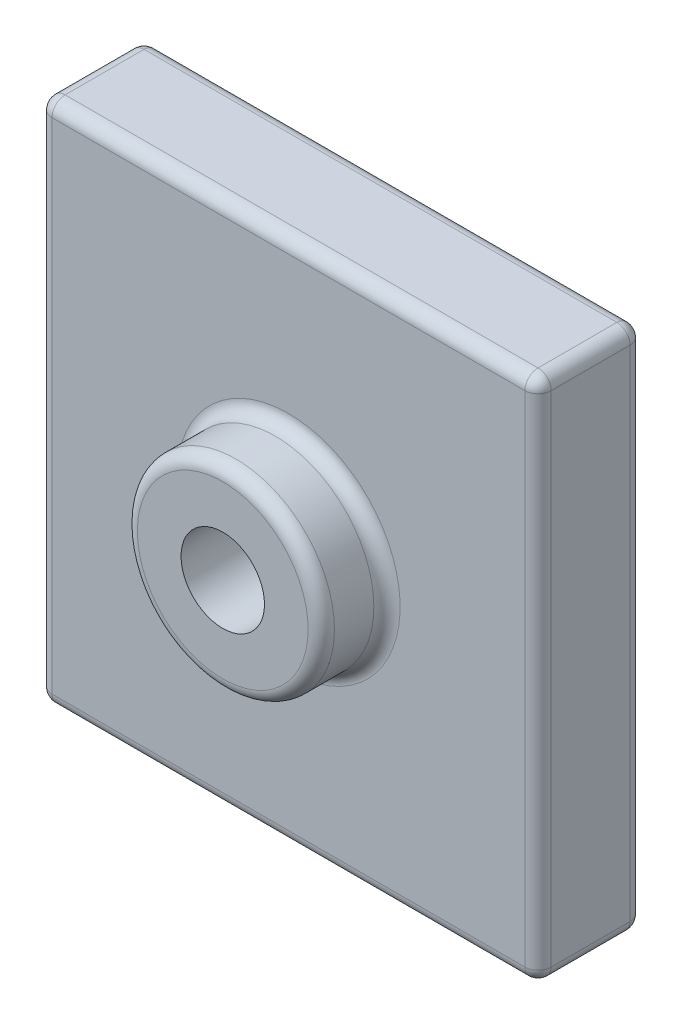
ISO-10303-21;
HEADER;
FILE_DESCRIPTION(('STEP AP214'),'2;1');
FILE_NAME('part.step','',(''),(''),'','','');
FILE_SCHEMA(('AUTOMOTIVE_DESIGN { 1 0 10303 214 1 1 1 1 }'));
ENDSEC;
DATA;
#1=APPLICATION_CONTEXT('core data for automotive mechanical design processes');
#2=APPLICATION_PROTOCOL_DEFINITION('international standard','automotive_design',2000,#1);
#3=PRODUCT_CONTEXT('',#1,'mechanical');
#4=PRODUCT('Part','Part','',(#3));
#5=PRODUCT_RELATED_PRODUCT_CATEGORY('part','',(#4));
#6=PRODUCT_DEFINITION_FORMATION('','',#4);
#7=PRODUCT_DEFINITION_CONTEXT('part definition',#1,'design');
#8=PRODUCT_DEFINITION('design','',#6,#7);
#9=PRODUCT_DEFINITION_SHAPE('','',#8);
#10=(LENGTH_UNIT() NAMED_UNIT(*) SI_UNIT(.MILLI.,.METRE.));
#11=(NAMED_UNIT(*) PLANE_ANGLE_UNIT() SI_UNIT($,.RADIAN.));
#12=(NAMED_UNIT(*) SI_UNIT($,.STERADIAN.) SOLID_ANGLE_UNIT());
#13=UNCERTAINTY_MEASURE_WITH_UNIT(LENGTH_MEASURE(1.E-05),#10,'distance_accuracy_value','');
#14=(GEOMETRIC_REPRESENTATION_CONTEXT(3) GLOBAL_UNCERTAINTY_ASSIGNED_CONTEXT((#13)) GLOBAL_UNIT_ASSIGNED_CONTEXT((#10,
#11,#12)) REPRESENTATION_CONTEXT('',''));
#15=CARTESIAN_POINT('',(0.,0.,0.));
#16=DIRECTION('',(0.,0.,1.));
#17=DIRECTION('',(1.,0.,0.));
#18=AXIS2_PLACEMENT_3D('',#15,#16,#17);
#19=CARTESIAN_POINT('',(0.,0.,8.));
#20=DIRECTION('',(1.,0.,0.));
#21=DIRECTION('',(0.,0.,-1.));
#22=AXIS2_PLACEMENT_3D('',#19,#20,#21);
#23=PLANE('',#22);
#24=DIRECTION('',(0.,0.,-1.));
#25=VECTOR('',#24,1.);
#26=CARTESIAN_POINT('',(0.,39.,8.));
#27=LINE('',#26,#25);
#28=CARTESIAN_POINT('',(0.,39.,7.));
#29=VERTEX_POINT('',#28);
#30=CARTESIAN_POINT('',(0.,39.,1.));
#31=VERTEX_POINT('',#30);
#32=EDGE_CURVE('E267',#29,#31,#27,.T.);
#33=ORIENTED_EDGE('',*,*,#32,.T.);
#34=DIRECTION('',(0.,-1.,0.));
#35=VECTOR('',#34,1.);
#36=CARTESIAN_POINT('',(0.,0.,1.));
#37=LINE('',#36,#35);
#38=CARTESIAN_POINT('',(0.,1.,1.));
#39=VERTEX_POINT('',#38);
#40=EDGE_CURVE('E270',#31,#39,#37,.T.);
#41=ORIENTED_EDGE('',*,*,#40,.T.);
#42=DIRECTION('',(0.,0.,-1.));
#43=VECTOR('',#42,1.);
#44=CARTESIAN_POINT('',(0.,1.,8.));
#45=LINE('',#44,#43);
#46=CARTESIAN_POINT('',(0.,1.,7.));
#47=VERTEX_POINT('',#46);
#48=EDGE_CURVE('E265',#39,#47,#45,.F.);
#49=ORIENTED_EDGE('',*,*,#48,.T.);
#50=DIRECTION('',(0.,-1.,0.));
#51=VECTOR('',#50,1.);
#52=CARTESIAN_POINT('',(0.,0.,7.));
#53=LINE('',#52,#51);
#54=EDGE_CURVE('E263',#47,#29,#53,.F.);
#55=ORIENTED_EDGE('',*,*,#54,.T.);
#56=EDGE_LOOP('',(#33,#41,#49,#55));
#57=FACE_BOUND('',#56,.T.);
#58=ADVANCED_FACE('F33',(#57),#23,.F.);
#59=CARTESIAN_POINT('',(0.,0.,8.));
#60=DIRECTION('',(0.,1.,0.));
#61=DIRECTION('',(0.,0.,1.));
#62=AXIS2_PLACEMENT_3D('',#59,#60,#61);
#63=PLANE('',#62);
#64=DIRECTION('',(0.,0.,-1.));
#65=VECTOR('',#64,1.);
#66=CARTESIAN_POINT('',(1.,0.,8.));
#67=LINE('',#66,#65);
#68=CARTESIAN_POINT('',(1.,0.,7.));
#69=VERTEX_POINT('',#68);
#70=CARTESIAN_POINT('',(1.,0.,1.));
#71=VERTEX_POINT('',#70);
#72=EDGE_CURVE('E229',#69,#71,#67,.T.);
#73=ORIENTED_EDGE('',*,*,#72,.T.);
#74=DIRECTION('',(1.,0.,0.));
#75=VECTOR('',#74,1.);
#76=CARTESIAN_POINT('',(38.,0.,1.));
#77=LINE('',#76,#75);
#78=CARTESIAN_POINT('',(37.,0.,1.));
#79=VERTEX_POINT('',#78);
#80=EDGE_CURVE('E233',#71,#79,#77,.T.);
#81=ORIENTED_EDGE('',*,*,#80,.T.);
#82=DIRECTION('',(0.,0.,-1.));
#83=VECTOR('',#82,1.);
#84=CARTESIAN_POINT('',(37.,0.,8.));
#85=LINE('',#84,#83);
#86=CARTESIAN_POINT('',(37.,0.,7.));
#87=VERTEX_POINT('',#86);
#88=EDGE_CURVE('E231',#79,#87,#85,.F.);
#89=ORIENTED_EDGE('',*,*,#88,.T.);
#90=DIRECTION('',(1.,0.,0.));
#91=VECTOR('',#90,1.);
#92=CARTESIAN_POINT('',(0.,0.,7.));
#93=LINE('',#92,#91);
#94=EDGE_CURVE('E227',#87,#69,#93,.F.);
#95=ORIENTED_EDGE('',*,*,#94,.T.);
#96=EDGE_LOOP('',(#73,#81,#89,#95));
#97=FACE_BOUND('',#96,.T.);
#98=ADVANCED_FACE('F435',(#97),#63,.F.);
#99=CARTESIAN_POINT('',(38.,0.,8.));
#100=DIRECTION('',(-1.,0.,0.));
#101=DIRECTION('',(0.,0.,1.));
#102=AXIS2_PLACEMENT_3D('',#99,#100,#101);
#103=PLANE('',#102);
#104=DIRECTION('',(0.,0.,-1.));
#105=VECTOR('',#104,1.);
#106=CARTESIAN_POINT('',(38.,1.,8.));
#107=LINE('',#106,#105);
#108=CARTESIAN_POINT('',(38.,1.,7.));
#109=VERTEX_POINT('',#108);
#110=CARTESIAN_POINT('',(38.,1.,1.));
#111=VERTEX_POINT('',#110);
#112=EDGE_CURVE('E258',#109,#111,#107,.T.);
#113=ORIENTED_EDGE('',*,*,#112,.T.);
#114=DIRECTION('',(0.,1.,0.));
#115=VECTOR('',#114,1.);
#116=CARTESIAN_POINT('',(38.,40.,1.));
#117=LINE('',#116,#115);
#118=CARTESIAN_POINT('',(38.,39.,1.));
#119=VERTEX_POINT('',#118);
#120=EDGE_CURVE('E261',#111,#119,#117,.T.);
#121=ORIENTED_EDGE('',*,*,#120,.T.);
#122=DIRECTION('',(0.,0.,-1.));
#123=VECTOR('',#122,1.);
#124=CARTESIAN_POINT('',(38.,39.,8.));
#125=LINE('',#124,#123);
#126=CARTESIAN_POINT('',(38.,39.,7.));
#127=VERTEX_POINT('',#126);
#128=EDGE_CURVE('E256',#119,#127,#125,.F.);
#129=ORIENTED_EDGE('',*,*,#128,.T.);
#130=DIRECTION('',(0.,1.,0.));
#131=VECTOR('',#130,1.);
#132=CARTESIAN_POINT('',(38.,0.,7.));
#133=LINE('',#132,#131);
#134=EDGE_CURVE('E254',#127,#109,#133,.F.);
#135=ORIENTED_EDGE('',*,*,#134,.T.);
#136=EDGE_LOOP('',(#113,#121,#129,#135));
#137=FACE_BOUND('',#136,.T.);
#138=ADVANCED_FACE('F440',(#137),#103,.F.);
#139=CARTESIAN_POINT('',(0.,40.,8.));
#140=DIRECTION('',(0.,-1.,0.));
#141=DIRECTION('',(0.,0.,-1.));
#142=AXIS2_PLACEMENT_3D('',#139,#140,#141);
#143=PLANE('',#142);
#144=DIRECTION('',(0.,0.,-1.));
#145=VECTOR('',#144,1.);
#146=CARTESIAN_POINT('',(37.,40.,8.));
#147=LINE('',#146,#145);
#148=CARTESIAN_POINT('',(37.,40.,7.));
#149=VERTEX_POINT('',#148);
#150=CARTESIAN_POINT('',(37.,40.,1.));
#151=VERTEX_POINT('',#150);
#152=EDGE_CURVE('E249',#149,#151,#147,.T.);
#153=ORIENTED_EDGE('',*,*,#152,.T.);
#154=DIRECTION('',(-1.,0.,0.));
#155=VECTOR('',#154,1.);
#156=CARTESIAN_POINT('',(0.,40.,1.));
#157=LINE('',#156,#155);
#158=CARTESIAN_POINT('',(1.,40.,1.));
#159=VERTEX_POINT('',#158);
#160=EDGE_CURVE('E251',#151,#159,#157,.T.);
#161=ORIENTED_EDGE('',*,*,#160,.T.);
#162=DIRECTION('',(0.,0.,-1.));
#163=VECTOR('',#162,1.);
#164=CARTESIAN_POINT('',(1.,40.,8.));
#165=LINE('',#164,#163);
#166=CARTESIAN_POINT('',(1.,40.,7.));
#167=VERTEX_POINT('',#166);
#168=EDGE_CURVE('E247',#159,#167,#165,.F.);
#169=ORIENTED_EDGE('',*,*,#168,.T.);
#170=DIRECTION('',(-1.,0.,0.));
#171=VECTOR('',#170,1.);
#172=CARTESIAN_POINT('',(0.,40.,7.));
#173=LINE('',#172,#171);
#174=EDGE_CURVE('E245',#167,#149,#173,.F.);
#175=ORIENTED_EDGE('',*,*,#174,.T.);
#176=EDGE_LOOP('',(#153,#161,#169,#175));
#177=FACE_BOUND('',#176,.T.);
#178=ADVANCED_FACE('F387',(#177),#143,.F.);
#179=CARTESIAN_POINT('',(0.,0.,8.));
#180=DIRECTION('',(0.,0.,-1.));
#181=DIRECTION('',(-1.,0.,0.));
#182=AXIS2_PLACEMENT_3D('',#179,#180,#181);
#183=PLANE('',#182);
#184=DIRECTION('',(0.,1.,0.));
#185=VECTOR('',#184,1.);
#186=CARTESIAN_POINT('',(37.,0.,8.));
#187=LINE('',#186,#185);
#188=CARTESIAN_POINT('',(37.,1.,8.));
#189=VERTEX_POINT('',#188);
#190=CARTESIAN_POINT('',(37.,39.,8.));
#191=VERTEX_POINT('',#190);
#192=EDGE_CURVE('E42',#189,#191,#187,.T.);
#193=ORIENTED_EDGE('',*,*,#192,.T.);
#194=DIRECTION('',(-1.,0.,0.));
#195=VECTOR('',#194,1.);
#196=CARTESIAN_POINT('',(0.,39.,8.));
#197=LINE('',#196,#195);
#198=CARTESIAN_POINT('',(1.,39.,8.));
#199=VERTEX_POINT('',#198);
#200=EDGE_CURVE('E11',#191,#199,#197,.T.);
#201=ORIENTED_EDGE('',*,*,#200,.T.);
#202=DIRECTION('',(0.,-1.,0.));
#203=VECTOR('',#202,1.);
#204=CARTESIAN_POINT('',(1.,0.,8.));
#205=LINE('',#204,#203);
#206=CARTESIAN_POINT('',(1.,1.,8.));
#207=VERTEX_POINT('',#206);
#208=EDGE_CURVE('E275',#199,#207,#205,.T.);
#209=ORIENTED_EDGE('',*,*,#208,.T.);
#210=DIRECTION('',(1.,0.,0.));
#211=VECTOR('',#210,1.);
#212=CARTESIAN_POINT('',(0.,1.,8.));
#213=LINE('',#212,#211);
#214=EDGE_CURVE('E277',#207,#189,#213,.T.);
#215=ORIENTED_EDGE('',*,*,#214,.T.);
#216=EDGE_LOOP('',(#193,#201,#209,#215));
#217=FACE_BOUND('',#216,.T.);
#218=CARTESIAN_POINT('',(19.,20.,8.));
#219=DIRECTION('',(0.,0.,-1.));
#220=DIRECTION('',(-1.,0.,0.));
#221=AXIS2_PLACEMENT_3D('',#218,#219,#220);
#222=CIRCLE('',#221,8.5);
#223=CARTESIAN_POINT('',(10.5,20.,8.));
#224=VERTEX_POINT('',#223);
#225=EDGE_CURVE('E272',#224,#224,#222,.T.);
#226=ORIENTED_EDGE('',*,*,#225,.T.);
#227=EDGE_LOOP('',(#226));
#228=FACE_BOUND('',#227,.T.);
#229=ADVANCED_FACE('F363',(#217,#228),#183,.F.);
#230=CARTESIAN_POINT('',(0.,0.,0.));
#231=DIRECTION('',(0.,0.,-1.));
#232=DIRECTION('',(-1.,0.,0.));
#233=AXIS2_PLACEMENT_3D('',#230,#231,#232);
#234=PLANE('',#233);
#235=DIRECTION('',(0.500000000000001,0.866025403784438,0.));
#236=VECTOR('',#235,1.);
#237=CARTESIAN_POINT('',(12.5839064584957,20.,0.));
#238=LINE('',#237,#236);
#239=CARTESIAN_POINT('',(12.5839064584957,20.,0.));
#240=VERTEX_POINT('',#239);
#241=CARTESIAN_POINT('',(15.7919532292478,25.5565,0.));
#242=VERTEX_POINT('',#241);
#243=EDGE_CURVE('E50',#240,#242,#238,.T.);
#244=ORIENTED_EDGE('',*,*,#243,.F.);
#245=DIRECTION('',(-0.5,0.866025403784439,0.));
#246=VECTOR('',#245,1.);
#247=CARTESIAN_POINT('',(15.7919532292478,14.4435,0.));
#248=LINE('',#247,#246);
#249=CARTESIAN_POINT('',(15.7919532292478,14.4435,0.));
#250=VERTEX_POINT('',#249);
#251=EDGE_CURVE('E180',#250,#240,#248,.T.);
#252=ORIENTED_EDGE('',*,*,#251,.F.);
#253=DIRECTION('',(-1.,0.,0.));
#254=VECTOR('',#253,1.);
#255=CARTESIAN_POINT('',(22.2080467707522,14.4435,0.));
#256=LINE('',#255,#254);
#257=CARTESIAN_POINT('',(22.2080467707522,14.4435,0.));
#258=VERTEX_POINT('',#257);
#259=EDGE_CURVE('E183',#258,#250,#256,.T.);
#260=ORIENTED_EDGE('',*,*,#259,.F.);
#261=DIRECTION('',(-0.5,-0.866025403784438,0.));
#262=VECTOR('',#261,1.);
#263=CARTESIAN_POINT('',(25.4160935415043,20.,0.));
#264=LINE('',#263,#262);
#265=CARTESIAN_POINT('',(25.4160935415043,20.,0.));
#266=VERTEX_POINT('',#265);
#267=EDGE_CURVE('E199',#266,#258,#264,.T.);
#268=ORIENTED_EDGE('',*,*,#267,.F.);
#269=DIRECTION('',(0.5,-0.866025403784438,0.));
#270=VECTOR('',#269,1.);
#271=CARTESIAN_POINT('',(22.2080467707522,25.5565,0.));
#272=LINE('',#271,#270);
#273=CARTESIAN_POINT('',(22.2080467707522,25.5565,0.));
#274=VERTEX_POINT('',#273);
#275=EDGE_CURVE('E196',#274,#266,#272,.T.);
#276=ORIENTED_EDGE('',*,*,#275,.F.);
#277=DIRECTION('',(1.,0.,0.));
#278=VECTOR('',#277,1.);
#279=CARTESIAN_POINT('',(15.7919532292478,25.5565,0.));
#280=LINE('',#279,#278);
#281=EDGE_CURVE('E194',#242,#274,#280,.T.);
#282=ORIENTED_EDGE('',*,*,#281,.F.);
#283=EDGE_LOOP('',(#244,#252,#260,#268,#276,#282));
#284=FACE_BOUND('',#283,.T.);
#285=DIRECTION('',(-1.,0.,0.));
#286=VECTOR('',#285,1.);
#287=CARTESIAN_POINT('',(38.,39.,0.));
#288=LINE('',#287,#286);
#289=CARTESIAN_POINT('',(1.,39.,0.));
#290=VERTEX_POINT('',#289);
#291=CARTESIAN_POINT('',(37.,39.,0.));
#292=VERTEX_POINT('',#291);
#293=EDGE_CURVE('E238',#290,#292,#288,.F.);
#294=ORIENTED_EDGE('',*,*,#293,.T.);
#295=DIRECTION('',(0.,1.,0.));
#296=VECTOR('',#295,1.);
#297=CARTESIAN_POINT('',(37.,0.,0.));
#298=LINE('',#297,#296);
#299=CARTESIAN_POINT('',(37.,1.,0.));
#300=VERTEX_POINT('',#299);
#301=EDGE_CURVE('E243',#292,#300,#298,.F.);
#302=ORIENTED_EDGE('',*,*,#301,.T.);
#303=DIRECTION('',(1.,0.,0.));
#304=VECTOR('',#303,1.);
#305=CARTESIAN_POINT('',(0.,1.,0.));
#306=LINE('',#305,#304);
#307=CARTESIAN_POINT('',(1.,1.,0.));
#308=VERTEX_POINT('',#307);
#309=EDGE_CURVE('E240',#300,#308,#306,.F.);
#310=ORIENTED_EDGE('',*,*,#309,.T.);
#311=DIRECTION('',(0.,-1.,0.));
#312=VECTOR('',#311,1.);
#313=CARTESIAN_POINT('',(1.,40.,0.));
#314=LINE('',#313,#312);
#315=EDGE_CURVE('E236',#308,#290,#314,.F.);
#316=ORIENTED_EDGE('',*,*,#315,.T.);
#317=EDGE_LOOP('',(#294,#302,#310,#316));
#318=FACE_BOUND('',#317,.T.);
#319=ADVANCED_FACE('F408',(#284,#318),#234,.T.);
#320=CARTESIAN_POINT('',(19.,20.,13.));
#321=DIRECTION('',(0.,0.,1.));
#322=DIRECTION('',(1.,0.,0.));
#323=AXIS2_PLACEMENT_3D('',#320,#321,#322);
#324=PLANE('',#323);
#325=CARTESIAN_POINT('',(19.,20.,13.));
#326=DIRECTION('',(0.,0.,1.));
#327=DIRECTION('',(1.,0.,0.));
#328=AXIS2_PLACEMENT_3D('',#325,#326,#327);
#329=CIRCLE('',#328,6.5);
#330=CARTESIAN_POINT('',(25.5,20.,13.));
#331=VERTEX_POINT('',#330);
#332=EDGE_CURVE('E217',#331,#331,#329,.T.);
#333=ORIENTED_EDGE('',*,*,#332,.T.);
#334=EDGE_LOOP('',(#333));
#335=FACE_BOUND('',#334,.T.);
#336=CARTESIAN_POINT('',(19.,20.,13.));
#337=DIRECTION('',(0.,0.,1.));
#338=DIRECTION('',(1.,0.,0.));
#339=AXIS2_PLACEMENT_3D('',#336,#337,#338);
#340=CIRCLE('',#339,3.175);
#341=CARTESIAN_POINT('',(22.175,20.,13.));
#342=VERTEX_POINT('',#341);
#343=EDGE_CURVE('E214',#342,#342,#340,.T.);
#344=ORIENTED_EDGE('',*,*,#343,.F.);
#345=EDGE_LOOP('',(#344));
#346=FACE_BOUND('',#345,.T.);
#347=ADVANCED_FACE('F707',(#335,#346),#324,.T.);
#348=CARTESIAN_POINT('',(19.,20.,13.));
#349=DIRECTION('',(0.,0.,-1.));
#350=DIRECTION('',(-1.,0.,0.));
#351=AXIS2_PLACEMENT_3D('',#348,#349,#350);
#352=CYLINDRICAL_SURFACE('',#351,7.5);
#353=CARTESIAN_POINT('',(19.,20.,12.));
#354=DIRECTION('',(0.,0.,1.));
#355=DIRECTION('',(1.,0.,0.));
#356=AXIS2_PLACEMENT_3D('',#353,#354,#355);
#357=CIRCLE('',#356,7.5);
#358=CARTESIAN_POINT('',(26.5,20.,12.));
#359=VERTEX_POINT('',#358);
#360=EDGE_CURVE('E224',#359,#359,#357,.F.);
#361=ORIENTED_EDGE('',*,*,#360,.T.);
#362=EDGE_LOOP('',(#361));
#363=FACE_BOUND('',#362,.T.);
#364=CARTESIAN_POINT('',(19.,20.,9.));
#365=DIRECTION('',(0.,0.,-1.));
#366=DIRECTION('',(-1.,0.,0.));
#367=AXIS2_PLACEMENT_3D('',#364,#365,#366);
#368=CIRCLE('',#367,7.5);
#369=CARTESIAN_POINT('',(11.5,20.,9.));
#370=VERTEX_POINT('',#369);
#371=EDGE_CURVE('E221',#370,#370,#368,.F.);
#372=ORIENTED_EDGE('',*,*,#371,.T.);
#373=EDGE_LOOP('',(#372));
#374=FACE_BOUND('',#373,.T.);
#375=ADVANCED_FACE('F569',(#363,#374),#352,.T.);
#376=CARTESIAN_POINT('',(19.,20.,13.));
#377=DIRECTION('',(0.,0.,-1.));
#378=DIRECTION('',(-1.,0.,0.));
#379=AXIS2_PLACEMENT_3D('',#376,#377,#378);
#380=CYLINDRICAL_SURFACE('',#379,3.175);
#381=ORIENTED_EDGE('',*,*,#343,.T.);
#382=EDGE_LOOP('',(#381));
#383=FACE_BOUND('',#382,.T.);
#384=CARTESIAN_POINT('',(19.,20.,5.55625));
#385=DIRECTION('',(0.,0.,-1.));
#386=DIRECTION('',(-1.,0.,0.));
#387=AXIS2_PLACEMENT_3D('',#384,#385,#386);
#388=CIRCLE('',#387,3.175);
#389=CARTESIAN_POINT('',(15.825,20.,5.55625));
#390=VERTEX_POINT('',#389);
#391=EDGE_CURVE('E37',#390,#390,#388,.T.);
#392=ORIENTED_EDGE('',*,*,#391,.T.);
#393=EDGE_LOOP('',(#392));
#394=FACE_BOUND('',#393,.T.);
#395=ADVANCED_FACE('F448',(#383,#394),#380,.F.);
#396=CARTESIAN_POINT('',(19.,20.,12.));
#397=DIRECTION('',(0.,0.,1.));
#398=DIRECTION('',(1.,0.,0.));
#399=AXIS2_PLACEMENT_3D('',#396,#397,#398);
#400=TOROIDAL_SURFACE('',#399,6.5,1.);
#401=ORIENTED_EDGE('',*,*,#360,.F.);
#402=EDGE_LOOP('',(#401));
#403=FACE_BOUND('',#402,.T.);
#404=ORIENTED_EDGE('',*,*,#332,.F.);
#405=EDGE_LOOP('',(#404));
#406=FACE_BOUND('',#405,.T.);
#407=ADVANCED_FACE('F445',(#403,#406),#400,.T.);
#408=CARTESIAN_POINT('',(0.,39.,7.));
#409=DIRECTION('',(-1.,0.,0.));
#410=DIRECTION('',(0.,0.,1.));
#411=AXIS2_PLACEMENT_3D('',#408,#409,#410);
#412=CYLINDRICAL_SURFACE('',#411,1.);
#413=CARTESIAN_POINT('',(1.,39.,7.));
#414=DIRECTION('',(-1.,0.,0.));
#415=DIRECTION('',(0.,0.,1.));
#416=AXIS2_PLACEMENT_3D('',#413,#414,#415);
#417=CIRCLE('',#416,1.);
#418=EDGE_CURVE('E218',#199,#167,#417,.T.);
#419=ORIENTED_EDGE('',*,*,#418,.F.);
#420=ORIENTED_EDGE('',*,*,#200,.F.);
#421=CARTESIAN_POINT('',(37.,39.,7.));
#422=DIRECTION('',(1.,0.,0.));
#423=DIRECTION('',(0.,0.,-1.));
#424=AXIS2_PLACEMENT_3D('',#421,#422,#423);
#425=CIRCLE('',#424,1.);
#426=EDGE_CURVE('E341',#149,#191,#425,.T.);
#427=ORIENTED_EDGE('',*,*,#426,.F.);
#428=ORIENTED_EDGE('',*,*,#174,.F.);
#429=EDGE_LOOP('',(#419,#420,#427,#428));
#430=FACE_BOUND('',#429,.T.);
#431=ADVANCED_FACE('F385',(#430),#412,.T.);
#432=CARTESIAN_POINT('',(1.,39.,7.));
#433=DIRECTION('',(0.,0.,1.));
#434=DIRECTION('',(1.,0.,0.));
#435=AXIS2_PLACEMENT_3D('',#432,#433,#434);
#436=SPHERICAL_SURFACE('',#435,1.);
#437=CARTESIAN_POINT('',(1.,39.,7.));
#438=DIRECTION('',(0.,1.,0.));
#439=DIRECTION('',(0.,0.,1.));
#440=AXIS2_PLACEMENT_3D('',#437,#438,#439);
#441=CIRCLE('',#440,1.);
#442=EDGE_CURVE('E335',#199,#29,#441,.F.);
#443=ORIENTED_EDGE('',*,*,#442,.F.);
#444=ORIENTED_EDGE('',*,*,#418,.T.);
#445=CARTESIAN_POINT('',(1.,39.,7.));
#446=DIRECTION('',(0.,0.,1.));
#447=DIRECTION('',(1.,0.,0.));
#448=AXIS2_PLACEMENT_3D('',#445,#446,#447);
#449=CIRCLE('',#448,1.);
#450=EDGE_CURVE('E338',#29,#167,#449,.F.);
#451=ORIENTED_EDGE('',*,*,#450,.F.);
#452=EDGE_LOOP('',(#443,#444,#451));
#453=FACE_BOUND('',#452,.T.);
#454=ADVANCED_FACE('F348',(#453),#436,.T.);
#455=CARTESIAN_POINT('',(37.,39.,7.));
#456=DIRECTION('',(0.,0.,1.));
#457=DIRECTION('',(1.,0.,0.));
#458=AXIS2_PLACEMENT_3D('',#455,#456,#457);
#459=SPHERICAL_SURFACE('',#458,1.);
#460=CARTESIAN_POINT('',(37.,39.,7.));
#461=DIRECTION('',(0.,0.,1.));
#462=DIRECTION('',(1.,0.,0.));
#463=AXIS2_PLACEMENT_3D('',#460,#461,#462);
#464=CIRCLE('',#463,1.);
#465=EDGE_CURVE('E329',#149,#127,#464,.F.);
#466=ORIENTED_EDGE('',*,*,#465,.F.);
#467=ORIENTED_EDGE('',*,*,#426,.T.);
#468=CARTESIAN_POINT('',(37.,39.,7.));
#469=DIRECTION('',(0.,1.,0.));
#470=DIRECTION('',(0.,0.,1.));
#471=AXIS2_PLACEMENT_3D('',#468,#469,#470);
#472=CIRCLE('',#471,1.);
#473=EDGE_CURVE('E332',#127,#191,#472,.F.);
#474=ORIENTED_EDGE('',*,*,#473,.F.);
#475=EDGE_LOOP('',(#466,#467,#474));
#476=FACE_BOUND('',#475,.T.);
#477=ADVANCED_FACE('F382',(#476),#459,.T.);
#478=CARTESIAN_POINT('',(1.,39.,8.));
#479=DIRECTION('',(0.,0.,-1.));
#480=DIRECTION('',(-1.,0.,0.));
#481=AXIS2_PLACEMENT_3D('',#478,#479,#480);
#482=CYLINDRICAL_SURFACE('',#481,1.);
#483=ORIENTED_EDGE('',*,*,#450,.T.);
#484=ORIENTED_EDGE('',*,*,#168,.F.);
#485=CARTESIAN_POINT('',(1.,39.,1.));
#486=DIRECTION('',(0.,0.,-1.));
#487=DIRECTION('',(-1.,0.,0.));
#488=AXIS2_PLACEMENT_3D('',#485,#486,#487);
#489=CIRCLE('',#488,1.);
#490=EDGE_CURVE('E324',#31,#159,#489,.T.);
#491=ORIENTED_EDGE('',*,*,#490,.F.);
#492=ORIENTED_EDGE('',*,*,#32,.F.);
#493=EDGE_LOOP('',(#483,#484,#491,#492));
#494=FACE_BOUND('',#493,.T.);
#495=ADVANCED_FACE('F354',(#494),#482,.T.);
#496=CARTESIAN_POINT('',(1.,0.,7.));
#497=DIRECTION('',(0.,-1.,0.));
#498=DIRECTION('',(0.,0.,-1.));
#499=AXIS2_PLACEMENT_3D('',#496,#497,#498);
#500=CYLINDRICAL_SURFACE('',#499,1.);
#501=ORIENTED_EDGE('',*,*,#442,.T.);
#502=ORIENTED_EDGE('',*,*,#54,.F.);
#503=CARTESIAN_POINT('',(1.,1.,7.));
#504=DIRECTION('',(0.,-1.,0.));
#505=DIRECTION('',(0.,0.,-1.));
#506=AXIS2_PLACEMENT_3D('',#503,#504,#505);
#507=CIRCLE('',#506,1.);
#508=EDGE_CURVE('E321',#207,#47,#507,.T.);
#509=ORIENTED_EDGE('',*,*,#508,.F.);
#510=ORIENTED_EDGE('',*,*,#208,.F.);
#511=EDGE_LOOP('',(#501,#502,#509,#510));
#512=FACE_BOUND('',#511,.T.);
#513=ADVANCED_FACE('F361',(#512),#500,.T.);
#514=CARTESIAN_POINT('',(0.,1.,7.));
#515=DIRECTION('',(1.,0.,0.));
#516=DIRECTION('',(0.,0.,-1.));
#517=AXIS2_PLACEMENT_3D('',#514,#515,#516);
#518=CYLINDRICAL_SURFACE('',#517,1.);
#519=CARTESIAN_POINT('',(37.,1.,7.));
#520=DIRECTION('',(1.,0.,0.));
#521=DIRECTION('',(0.,0.,-1.));
#522=AXIS2_PLACEMENT_3D('',#519,#520,#521);
#523=CIRCLE('',#522,1.);
#524=EDGE_CURVE('E315',#189,#87,#523,.T.);
#525=ORIENTED_EDGE('',*,*,#524,.F.);
#526=ORIENTED_EDGE('',*,*,#214,.F.);
#527=CARTESIAN_POINT('',(1.,1.,7.));
#528=DIRECTION('',(-1.,0.,0.));
#529=DIRECTION('',(0.,0.,1.));
#530=AXIS2_PLACEMENT_3D('',#527,#528,#529);
#531=CIRCLE('',#530,1.);
#532=EDGE_CURVE('E318',#69,#207,#531,.T.);
#533=ORIENTED_EDGE('',*,*,#532,.F.);
#534=ORIENTED_EDGE('',*,*,#94,.F.);
#535=EDGE_LOOP('',(#525,#526,#533,#534));
#536=FACE_BOUND('',#535,.T.);
#537=ADVANCED_FACE('F368',(#536),#518,.T.);
#538=CARTESIAN_POINT('',(37.,0.,7.));
#539=DIRECTION('',(0.,1.,0.));
#540=DIRECTION('',(0.,0.,1.));
#541=AXIS2_PLACEMENT_3D('',#538,#539,#540);
#542=CYLINDRICAL_SURFACE('',#541,1.);
#543=ORIENTED_EDGE('',*,*,#473,.T.);
#544=ORIENTED_EDGE('',*,*,#192,.F.);
#545=CARTESIAN_POINT('',(37.,1.,7.));
#546=DIRECTION('',(0.,-1.,0.));
#547=DIRECTION('',(0.,0.,-1.));
#548=AXIS2_PLACEMENT_3D('',#545,#546,#547);
#549=CIRCLE('',#548,1.);
#550=EDGE_CURVE('E312',#109,#189,#549,.T.);
#551=ORIENTED_EDGE('',*,*,#550,.F.);
#552=ORIENTED_EDGE('',*,*,#134,.F.);
#553=EDGE_LOOP('',(#543,#544,#551,#552));
#554=FACE_BOUND('',#553,.T.);
#555=ADVANCED_FACE('F378',(#554),#542,.T.);
#556=CARTESIAN_POINT('',(37.,39.,8.));
#557=DIRECTION('',(0.,0.,-1.));
#558=DIRECTION('',(-1.,0.,0.));
#559=AXIS2_PLACEMENT_3D('',#556,#557,#558);
#560=CYLINDRICAL_SURFACE('',#559,1.);
#561=ORIENTED_EDGE('',*,*,#465,.T.);
#562=ORIENTED_EDGE('',*,*,#128,.F.);
#563=CARTESIAN_POINT('',(37.,39.,1.));
#564=DIRECTION('',(0.,0.,-1.));
#565=DIRECTION('',(-1.,0.,0.));
#566=AXIS2_PLACEMENT_3D('',#563,#564,#565);
#567=CIRCLE('',#566,1.);
#568=EDGE_CURVE('E309',#151,#119,#567,.T.);
#569=ORIENTED_EDGE('',*,*,#568,.F.);
#570=ORIENTED_EDGE('',*,*,#152,.F.);
#571=EDGE_LOOP('',(#561,#562,#569,#570));
#572=FACE_BOUND('',#571,.T.);
#573=ADVANCED_FACE('F398',(#572),#560,.T.);
#574=CARTESIAN_POINT('',(0.,39.,1.));
#575=DIRECTION('',(1.,0.,0.));
#576=DIRECTION('',(0.,0.,-1.));
#577=AXIS2_PLACEMENT_3D('',#574,#575,#576);
#578=CYLINDRICAL_SURFACE('',#577,1.);
#579=CARTESIAN_POINT('',(1.,39.,1.));
#580=DIRECTION('',(-1.,0.,0.));
#581=DIRECTION('',(0.,0.,1.));
#582=AXIS2_PLACEMENT_3D('',#579,#580,#581);
#583=CIRCLE('',#582,1.);
#584=EDGE_CURVE('E326',#159,#290,#583,.T.);
#585=ORIENTED_EDGE('',*,*,#584,.F.);
#586=ORIENTED_EDGE('',*,*,#160,.F.);
#587=CARTESIAN_POINT('',(37.,39.,1.));
#588=DIRECTION('',(1.,0.,0.));
#589=DIRECTION('',(0.,0.,-1.));
#590=AXIS2_PLACEMENT_3D('',#587,#588,#589);
#591=CIRCLE('',#590,1.);
#592=EDGE_CURVE('E306',#292,#151,#591,.T.);
#593=ORIENTED_EDGE('',*,*,#592,.F.);
#594=ORIENTED_EDGE('',*,*,#293,.F.);
#595=EDGE_LOOP('',(#585,#586,#593,#594));
#596=FACE_BOUND('',#595,.T.);
#597=ADVANCED_FACE('F393',(#596),#578,.T.);
#598=CARTESIAN_POINT('',(1.,39.,1.));
#599=DIRECTION('',(0.,0.,1.));
#600=DIRECTION('',(1.,0.,0.));
#601=AXIS2_PLACEMENT_3D('',#598,#599,#600);
#602=SPHERICAL_SURFACE('',#601,1.);
#603=ORIENTED_EDGE('',*,*,#490,.T.);
#604=ORIENTED_EDGE('',*,*,#584,.T.);
#605=CARTESIAN_POINT('',(1.,39.,1.));
#606=DIRECTION('',(0.,1.,0.));
#607=DIRECTION('',(0.,0.,1.));
#608=AXIS2_PLACEMENT_3D('',#605,#606,#607);
#609=CIRCLE('',#608,1.);
#610=EDGE_CURVE('E303',#31,#290,#609,.F.);
#611=ORIENTED_EDGE('',*,*,#610,.F.);
#612=EDGE_LOOP('',(#603,#604,#611));
#613=FACE_BOUND('',#612,.T.);
#614=ADVANCED_FACE('F412',(#613),#602,.T.);
#615=CARTESIAN_POINT('',(1.,1.,7.));
#616=DIRECTION('',(0.,0.,1.));
#617=DIRECTION('',(1.,0.,0.));
#618=AXIS2_PLACEMENT_3D('',#615,#616,#617);
#619=SPHERICAL_SURFACE('',#618,1.);
#620=ORIENTED_EDGE('',*,*,#532,.T.);
#621=ORIENTED_EDGE('',*,*,#508,.T.);
#622=CARTESIAN_POINT('',(1.,1.,7.));
#623=DIRECTION('',(0.,0.,1.));
#624=DIRECTION('',(1.,0.,0.));
#625=AXIS2_PLACEMENT_3D('',#622,#623,#624);
#626=CIRCLE('',#625,1.);
#627=EDGE_CURVE('E300',#69,#47,#626,.F.);
#628=ORIENTED_EDGE('',*,*,#627,.F.);
#629=EDGE_LOOP('',(#620,#621,#628));
#630=FACE_BOUND('',#629,.T.);
#631=ADVANCED_FACE('F425',(#630),#619,.T.);
#632=CARTESIAN_POINT('',(37.,1.,7.));
#633=DIRECTION('',(0.,0.,1.));
#634=DIRECTION('',(1.,0.,0.));
#635=AXIS2_PLACEMENT_3D('',#632,#633,#634);
#636=SPHERICAL_SURFACE('',#635,1.);
#637=ORIENTED_EDGE('',*,*,#550,.T.);
#638=ORIENTED_EDGE('',*,*,#524,.T.);
#639=CARTESIAN_POINT('',(37.,1.,7.));
#640=DIRECTION('',(0.,0.,1.));
#641=DIRECTION('',(1.,0.,0.));
#642=AXIS2_PLACEMENT_3D('',#639,#640,#641);
#643=CIRCLE('',#642,1.);
#644=EDGE_CURVE('E297',#109,#87,#643,.F.);
#645=ORIENTED_EDGE('',*,*,#644,.F.);
#646=EDGE_LOOP('',(#637,#638,#645));
#647=FACE_BOUND('',#646,.T.);
#648=ADVANCED_FACE('F374',(#647),#636,.T.);
#649=CARTESIAN_POINT('',(37.,39.,1.));
#650=DIRECTION('',(0.,0.,1.));
#651=DIRECTION('',(1.,0.,0.));
#652=AXIS2_PLACEMENT_3D('',#649,#650,#651);
#653=SPHERICAL_SURFACE('',#652,1.);
#654=ORIENTED_EDGE('',*,*,#592,.T.);
#655=ORIENTED_EDGE('',*,*,#568,.T.);
#656=CARTESIAN_POINT('',(37.,39.,1.));
#657=DIRECTION('',(0.,1.,0.));
#658=DIRECTION('',(0.,0.,1.));
#659=AXIS2_PLACEMENT_3D('',#656,#657,#658);
#660=CIRCLE('',#659,1.);
#661=EDGE_CURVE('E294',#292,#119,#660,.F.);
#662=ORIENTED_EDGE('',*,*,#661,.F.);
#663=EDGE_LOOP('',(#654,#655,#662));
#664=FACE_BOUND('',#663,.T.);
#665=ADVANCED_FACE('F400',(#664),#653,.T.);
#666=CARTESIAN_POINT('',(1.,0.,1.));
#667=DIRECTION('',(0.,1.,0.));
#668=DIRECTION('',(0.,0.,1.));
#669=AXIS2_PLACEMENT_3D('',#666,#667,#668);
#670=CYLINDRICAL_SURFACE('',#669,1.);
#671=ORIENTED_EDGE('',*,*,#610,.T.);
#672=ORIENTED_EDGE('',*,*,#315,.F.);
#673=CARTESIAN_POINT('',(1.,1.,1.));
#674=DIRECTION('',(0.,-1.,0.));
#675=DIRECTION('',(0.,0.,-1.));
#676=AXIS2_PLACEMENT_3D('',#673,#674,#675);
#677=CIRCLE('',#676,1.);
#678=EDGE_CURVE('E291',#39,#308,#677,.T.);
#679=ORIENTED_EDGE('',*,*,#678,.F.);
#680=ORIENTED_EDGE('',*,*,#40,.F.);
#681=EDGE_LOOP('',(#671,#672,#679,#680));
#682=FACE_BOUND('',#681,.T.);
#683=ADVANCED_FACE('F414',(#682),#670,.T.);
#684=CARTESIAN_POINT('',(1.,1.,8.));
#685=DIRECTION('',(0.,0.,-1.));
#686=DIRECTION('',(-1.,0.,0.));
#687=AXIS2_PLACEMENT_3D('',#684,#685,#686);
#688=CYLINDRICAL_SURFACE('',#687,1.);
#689=ORIENTED_EDGE('',*,*,#627,.T.);
#690=ORIENTED_EDGE('',*,*,#48,.F.);
#691=CARTESIAN_POINT('',(1.,1.,1.));
#692=DIRECTION('',(0.,0.,-1.));
#693=DIRECTION('',(-1.,0.,0.));
#694=AXIS2_PLACEMENT_3D('',#691,#692,#693);
#695=CIRCLE('',#694,1.);
#696=EDGE_CURVE('E288',#71,#39,#695,.T.);
#697=ORIENTED_EDGE('',*,*,#696,.F.);
#698=ORIENTED_EDGE('',*,*,#72,.F.);
#699=EDGE_LOOP('',(#689,#690,#697,#698));
#700=FACE_BOUND('',#699,.T.);
#701=ADVANCED_FACE('F423',(#700),#688,.T.);
#702=CARTESIAN_POINT('',(37.,1.,8.));
#703=DIRECTION('',(0.,0.,-1.));
#704=DIRECTION('',(-1.,0.,0.));
#705=AXIS2_PLACEMENT_3D('',#702,#703,#704);
#706=CYLINDRICAL_SURFACE('',#705,1.);
#707=ORIENTED_EDGE('',*,*,#644,.T.);
#708=ORIENTED_EDGE('',*,*,#88,.F.);
#709=CARTESIAN_POINT('',(37.,1.,1.));
#710=DIRECTION('',(0.,0.,-1.));
#711=DIRECTION('',(-1.,0.,0.));
#712=AXIS2_PLACEMENT_3D('',#709,#710,#711);
#713=CIRCLE('',#712,1.);
#714=EDGE_CURVE('E285',#111,#79,#713,.T.);
#715=ORIENTED_EDGE('',*,*,#714,.F.);
#716=ORIENTED_EDGE('',*,*,#112,.F.);
#717=EDGE_LOOP('',(#707,#708,#715,#716));
#718=FACE_BOUND('',#717,.T.);
#719=ADVANCED_FACE('F462',(#718),#706,.T.);
#720=CARTESIAN_POINT('',(37.,0.,1.));
#721=DIRECTION('',(0.,-1.,0.));
#722=DIRECTION('',(0.,0.,-1.));
#723=AXIS2_PLACEMENT_3D('',#720,#721,#722);
#724=CYLINDRICAL_SURFACE('',#723,1.);
#725=ORIENTED_EDGE('',*,*,#661,.T.);
#726=ORIENTED_EDGE('',*,*,#120,.F.);
#727=CARTESIAN_POINT('',(37.,1.,1.));
#728=DIRECTION('',(0.,-1.,0.));
#729=DIRECTION('',(0.,0.,-1.));
#730=AXIS2_PLACEMENT_3D('',#727,#728,#729);
#731=CIRCLE('',#730,1.);
#732=EDGE_CURVE('E283',#300,#111,#731,.T.);
#733=ORIENTED_EDGE('',*,*,#732,.F.);
#734=ORIENTED_EDGE('',*,*,#301,.F.);
#735=EDGE_LOOP('',(#725,#726,#733,#734));
#736=FACE_BOUND('',#735,.T.);
#737=ADVANCED_FACE('F405',(#736),#724,.T.);
#738=CARTESIAN_POINT('',(1.,1.,1.));
#739=DIRECTION('',(0.,0.,1.));
#740=DIRECTION('',(1.,0.,0.));
#741=AXIS2_PLACEMENT_3D('',#738,#739,#740);
#742=SPHERICAL_SURFACE('',#741,1.);
#743=ORIENTED_EDGE('',*,*,#696,.T.);
#744=ORIENTED_EDGE('',*,*,#678,.T.);
#745=CARTESIAN_POINT('',(1.,1.,1.));
#746=DIRECTION('',(-1.,0.,0.));
#747=DIRECTION('',(0.,0.,1.));
#748=AXIS2_PLACEMENT_3D('',#745,#746,#747);
#749=CIRCLE('',#748,1.);
#750=EDGE_CURVE('E281',#71,#308,#749,.F.);
#751=ORIENTED_EDGE('',*,*,#750,.F.);
#752=EDGE_LOOP('',(#743,#744,#751));
#753=FACE_BOUND('',#752,.T.);
#754=ADVANCED_FACE('F419',(#753),#742,.T.);
#755=CARTESIAN_POINT('',(37.,1.,1.));
#756=DIRECTION('',(0.,0.,1.));
#757=DIRECTION('',(1.,0.,0.));
#758=AXIS2_PLACEMENT_3D('',#755,#756,#757);
#759=SPHERICAL_SURFACE('',#758,1.);
#760=ORIENTED_EDGE('',*,*,#732,.T.);
#761=ORIENTED_EDGE('',*,*,#714,.T.);
#762=CARTESIAN_POINT('',(37.,1.,1.));
#763=DIRECTION('',(1.,0.,0.));
#764=DIRECTION('',(0.,0.,-1.));
#765=AXIS2_PLACEMENT_3D('',#762,#763,#764);
#766=CIRCLE('',#765,1.);
#767=EDGE_CURVE('E206',#300,#79,#766,.F.);
#768=ORIENTED_EDGE('',*,*,#767,.F.);
#769=EDGE_LOOP('',(#760,#761,#768));
#770=FACE_BOUND('',#769,.T.);
#771=ADVANCED_FACE('F453',(#770),#759,.T.);
#772=CARTESIAN_POINT('',(0.,1.,1.));
#773=DIRECTION('',(-1.,0.,0.));
#774=DIRECTION('',(0.,0.,1.));
#775=AXIS2_PLACEMENT_3D('',#772,#773,#774);
#776=CYLINDRICAL_SURFACE('',#775,1.);
#777=ORIENTED_EDGE('',*,*,#750,.T.);
#778=ORIENTED_EDGE('',*,*,#309,.F.);
#779=ORIENTED_EDGE('',*,*,#767,.T.);
#780=ORIENTED_EDGE('',*,*,#80,.F.);
#781=EDGE_LOOP('',(#777,#778,#779,#780));
#782=FACE_BOUND('',#781,.T.);
#783=ADVANCED_FACE('F450',(#782),#776,.T.);
#784=CARTESIAN_POINT('',(19.,20.,9.));
#785=DIRECTION('',(0.,0.,-1.));
#786=DIRECTION('',(-1.,0.,0.));
#787=AXIS2_PLACEMENT_3D('',#784,#785,#786);
#788=TOROIDAL_SURFACE('',#787,8.5,1.);
#789=ORIENTED_EDGE('',*,*,#225,.F.);
#790=EDGE_LOOP('',(#789));
#791=FACE_BOUND('',#790,.T.);
#792=ORIENTED_EDGE('',*,*,#371,.F.);
#793=EDGE_LOOP('',(#792));
#794=FACE_BOUND('',#793,.T.);
#795=ADVANCED_FACE('F35',(#791,#794),#788,.F.);
#796=CARTESIAN_POINT('',(12.5839064584957,20.,5.55625));
#797=DIRECTION('',(-0.866025403784438,0.500000000000001,0.));
#798=DIRECTION('',(-0.500000000000001,-0.866025403784438,0.));
#799=AXIS2_PLACEMENT_3D('',#796,#797,#798);
#800=PLANE('',#799);
#801=ORIENTED_EDGE('',*,*,#243,.T.);
#802=DIRECTION('',(0.,0.,-1.));
#803=VECTOR('',#802,1.);
#804=CARTESIAN_POINT('',(15.7919532292478,25.5565,5.55625));
#805=LINE('',#804,#803);
#806=CARTESIAN_POINT('',(15.7919532292478,25.5565,5.55625));
#807=VERTEX_POINT('',#806);
#808=EDGE_CURVE('E157',#807,#242,#805,.T.);
#809=ORIENTED_EDGE('',*,*,#808,.F.);
#810=DIRECTION('',(0.500000000000001,0.866025403784438,0.));
#811=VECTOR('',#810,1.);
#812=CARTESIAN_POINT('',(12.5839064584957,20.,5.55625));
#813=LINE('',#812,#811);
#814=CARTESIAN_POINT('',(12.5839064584957,20.,5.55625));
#815=VERTEX_POINT('',#814);
#816=EDGE_CURVE('E161',#815,#807,#813,.T.);
#817=ORIENTED_EDGE('',*,*,#816,.F.);
#818=DIRECTION('',(0.,0.,-1.));
#819=VECTOR('',#818,1.);
#820=CARTESIAN_POINT('',(12.5839064584957,20.,5.55625));
#821=LINE('',#820,#819);
#822=EDGE_CURVE('E204',#815,#240,#821,.T.);
#823=ORIENTED_EDGE('',*,*,#822,.T.);
#824=EDGE_LOOP('',(#801,#809,#817,#823));
#825=FACE_BOUND('',#824,.T.);
#826=ADVANCED_FACE('F159',(#825),#800,.F.);
#827=CARTESIAN_POINT('',(15.7919532292478,14.4435,5.55625));
#828=DIRECTION('',(-0.866025403784439,-0.5,0.));
#829=DIRECTION('',(0.5,-0.866025403784439,0.));
#830=AXIS2_PLACEMENT_3D('',#827,#828,#829);
#831=PLANE('',#830);
#832=ORIENTED_EDGE('',*,*,#251,.T.);
#833=ORIENTED_EDGE('',*,*,#822,.F.);
#834=DIRECTION('',(-0.5,0.866025403784439,0.));
#835=VECTOR('',#834,1.);
#836=CARTESIAN_POINT('',(15.7919532292478,14.4435,5.55625));
#837=LINE('',#836,#835);
#838=CARTESIAN_POINT('',(15.7919532292478,14.4435,5.55625));
#839=VERTEX_POINT('',#838);
#840=EDGE_CURVE('E167',#839,#815,#837,.T.);
#841=ORIENTED_EDGE('',*,*,#840,.F.);
#842=DIRECTION('',(0.,0.,-1.));
#843=VECTOR('',#842,1.);
#844=CARTESIAN_POINT('',(15.7919532292478,14.4435,5.55625));
#845=LINE('',#844,#843);
#846=EDGE_CURVE('E207',#839,#250,#845,.T.);
#847=ORIENTED_EDGE('',*,*,#846,.T.);
#848=EDGE_LOOP('',(#832,#833,#841,#847));
#849=FACE_BOUND('',#848,.T.);
#850=ADVANCED_FACE('F516',(#849),#831,.F.);
#851=CARTESIAN_POINT('',(22.2080467707522,14.4435,5.55625));
#852=DIRECTION('',(0.,-1.,0.));
#853=DIRECTION('',(0.,0.,-1.));
#854=AXIS2_PLACEMENT_3D('',#851,#852,#853);
#855=PLANE('',#854);
#856=ORIENTED_EDGE('',*,*,#259,.T.);
#857=ORIENTED_EDGE('',*,*,#846,.F.);
#858=DIRECTION('',(-1.,0.,0.));
#859=VECTOR('',#858,1.);
#860=CARTESIAN_POINT('',(22.2080467707522,14.4435,5.55625));
#861=LINE('',#860,#859);
#862=CARTESIAN_POINT('',(22.2080467707522,14.4435,5.55625));
#863=VERTEX_POINT('',#862);
#864=EDGE_CURVE('E190',#863,#839,#861,.T.);
#865=ORIENTED_EDGE('',*,*,#864,.F.);
#866=DIRECTION('',(0.,0.,-1.));
#867=VECTOR('',#866,1.);
#868=CARTESIAN_POINT('',(22.2080467707522,14.4435,5.55625));
#869=LINE('',#868,#867);
#870=EDGE_CURVE('E209',#863,#258,#869,.T.);
#871=ORIENTED_EDGE('',*,*,#870,.T.);
#872=EDGE_LOOP('',(#856,#857,#865,#871));
#873=FACE_BOUND('',#872,.T.);
#874=ADVANCED_FACE('F523',(#873),#855,.F.);
#875=CARTESIAN_POINT('',(25.4160935415043,20.,5.55625));
#876=DIRECTION('',(0.866025403784438,-0.5,0.));
#877=DIRECTION('',(0.5,0.866025403784439,0.));
#878=AXIS2_PLACEMENT_3D('',#875,#876,#877);
#879=PLANE('',#878);
#880=ORIENTED_EDGE('',*,*,#267,.T.);
#881=ORIENTED_EDGE('',*,*,#870,.F.);
#882=DIRECTION('',(-0.5,-0.866025403784438,0.));
#883=VECTOR('',#882,1.);
#884=CARTESIAN_POINT('',(25.4160935415043,20.,5.55625));
#885=LINE('',#884,#883);
#886=CARTESIAN_POINT('',(25.4160935415043,20.,5.55625));
#887=VERTEX_POINT('',#886);
#888=EDGE_CURVE('E187',#887,#863,#885,.T.);
#889=ORIENTED_EDGE('',*,*,#888,.F.);
#890=DIRECTION('',(0.,0.,-1.));
#891=VECTOR('',#890,1.);
#892=CARTESIAN_POINT('',(25.4160935415043,20.,5.55625));
#893=LINE('',#892,#891);
#894=EDGE_CURVE('E211',#887,#266,#893,.T.);
#895=ORIENTED_EDGE('',*,*,#894,.T.);
#896=EDGE_LOOP('',(#880,#881,#889,#895));
#897=FACE_BOUND('',#896,.T.);
#898=ADVANCED_FACE('F531',(#897),#879,.F.);
#899=CARTESIAN_POINT('',(22.2080467707522,25.5565,5.55625));
#900=DIRECTION('',(0.866025403784438,0.5,0.));
#901=DIRECTION('',(-0.5,0.866025403784439,0.));
#902=AXIS2_PLACEMENT_3D('',#899,#900,#901);
#903=PLANE('',#902);
#904=ORIENTED_EDGE('',*,*,#275,.T.);
#905=ORIENTED_EDGE('',*,*,#894,.F.);
#906=DIRECTION('',(0.5,-0.866025403784438,0.));
#907=VECTOR('',#906,1.);
#908=CARTESIAN_POINT('',(22.2080467707522,25.5565,5.55625));
#909=LINE('',#908,#907);
#910=CARTESIAN_POINT('',(22.2080467707522,25.5565,5.55625));
#911=VERTEX_POINT('',#910);
#912=EDGE_CURVE('E175',#911,#887,#909,.T.);
#913=ORIENTED_EDGE('',*,*,#912,.F.);
#914=DIRECTION('',(0.,0.,-1.));
#915=VECTOR('',#914,1.);
#916=CARTESIAN_POINT('',(22.2080467707522,25.5565,5.55625));
#917=LINE('',#916,#915);
#918=EDGE_CURVE('E166',#911,#274,#917,.T.);
#919=ORIENTED_EDGE('',*,*,#918,.T.);
#920=EDGE_LOOP('',(#904,#905,#913,#919));
#921=FACE_BOUND('',#920,.T.);
#922=ADVANCED_FACE('F539',(#921),#903,.F.);
#923=CARTESIAN_POINT('',(15.7919532292478,25.5565,5.55625));
#924=DIRECTION('',(0.,1.,0.));
#925=DIRECTION('',(0.,0.,1.));
#926=AXIS2_PLACEMENT_3D('',#923,#924,#925);
#927=PLANE('',#926);
#928=ORIENTED_EDGE('',*,*,#281,.T.);
#929=ORIENTED_EDGE('',*,*,#918,.F.);
#930=DIRECTION('',(1.,0.,0.));
#931=VECTOR('',#930,1.);
#932=CARTESIAN_POINT('',(15.7919532292478,25.5565,5.55625));
#933=LINE('',#932,#931);
#934=EDGE_CURVE('E170',#807,#911,#933,.T.);
#935=ORIENTED_EDGE('',*,*,#934,.F.);
#936=ORIENTED_EDGE('',*,*,#808,.T.);
#937=EDGE_LOOP('',(#928,#929,#935,#936));
#938=FACE_BOUND('',#937,.T.);
#939=ADVANCED_FACE('F171',(#938),#927,.F.);
#940=CARTESIAN_POINT('',(0.,0.,5.55625));
#941=DIRECTION('',(0.,0.,-1.));
#942=DIRECTION('',(-1.,0.,0.));
#943=AXIS2_PLACEMENT_3D('',#940,#941,#942);
#944=PLANE('',#943);
#945=ORIENTED_EDGE('',*,*,#391,.F.);
#946=EDGE_LOOP('',(#945));
#947=FACE_BOUND('',#946,.T.);
#948=ORIENTED_EDGE('',*,*,#816,.T.);
#949=ORIENTED_EDGE('',*,*,#934,.T.);
#950=ORIENTED_EDGE('',*,*,#912,.T.);
#951=ORIENTED_EDGE('',*,*,#888,.T.);
#952=ORIENTED_EDGE('',*,*,#864,.T.);
#953=ORIENTED_EDGE('',*,*,#840,.T.);
#954=EDGE_LOOP('',(#948,#949,#950,#951,#952,#953));
#955=FACE_BOUND('',#954,.T.);
#956=ADVANCED_FACE('F177',(#947,#955),#944,.T.);
#957=CLOSED_SHELL('',(#58,#98,#138,#178,#229,#319,#347,#375,#395,#407,#431,#454,#477,#495,#513,
#537,#555,#573,#597,#614,#631,#648,#665,#683,#701,#719,#737,#754,#771,#783,#795,#826,#850,#874,
#898,#922,#939,#956));
#958=MANIFOLD_SOLID_BREP('B2',#957);
#959=ADVANCED_BREP_SHAPE_REPRESENTATION('',(#18,#958),#14);
#960=SHAPE_DEFINITION_REPRESENTATION(#9,#959);
ENDSEC;
END-ISO-10303-21;
